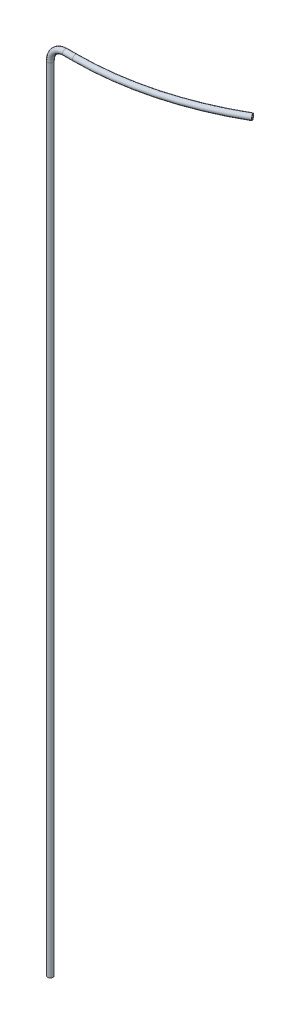
ISO-10303-21;
HEADER;
FILE_DESCRIPTION(('STEP AP214'),'2;1');
FILE_NAME('part.step','',(''),(''),'','','');
FILE_SCHEMA(('AUTOMOTIVE_DESIGN { 1 0 10303 214 1 1 1 1 }'));
ENDSEC;
DATA;
#1=APPLICATION_CONTEXT('core data for automotive mechanical design processes');
#2=APPLICATION_PROTOCOL_DEFINITION('international standard','automotive_design',2000,#1);
#3=PRODUCT_CONTEXT('',#1,'mechanical');
#4=PRODUCT('Part','Part','',(#3));
#5=PRODUCT_RELATED_PRODUCT_CATEGORY('part','',(#4));
#6=PRODUCT_DEFINITION_FORMATION('','',#4);
#7=PRODUCT_DEFINITION_CONTEXT('part definition',#1,'design');
#8=PRODUCT_DEFINITION('design','',#6,#7);
#9=PRODUCT_DEFINITION_SHAPE('','',#8);
#10=(LENGTH_UNIT() NAMED_UNIT(*) SI_UNIT(.MILLI.,.METRE.));
#11=(NAMED_UNIT(*) PLANE_ANGLE_UNIT() SI_UNIT($,.RADIAN.));
#12=(NAMED_UNIT(*) SI_UNIT($,.STERADIAN.) SOLID_ANGLE_UNIT());
#13=UNCERTAINTY_MEASURE_WITH_UNIT(LENGTH_MEASURE(1.E-05),#10,'distance_accuracy_value','');
#14=(GEOMETRIC_REPRESENTATION_CONTEXT(3) GLOBAL_UNCERTAINTY_ASSIGNED_CONTEXT((#13)) GLOBAL_UNIT_ASSIGNED_CONTEXT((#10,
#11,#12)) REPRESENTATION_CONTEXT('',''));
#15=CARTESIAN_POINT('',(0.,0.,0.));
#16=DIRECTION('',(0.,0.,1.));
#17=DIRECTION('',(1.,0.,0.));
#18=AXIS2_PLACEMENT_3D('',#15,#16,#17);
#19=CARTESIAN_POINT('',(0.,-0.371055821718923,-1900.));
#20=DIRECTION('',(0.,-1.,0.));
#21=DIRECTION('',(0.,0.,-1.));
#22=AXIS2_PLACEMENT_3D('',#19,#20,#21);
#23=TOROIDAL_SURFACE('',#22,600.,6.0000000000001);
#24=CARTESIAN_POINT('',(300.000000000001,-0.371055821718923,-1380.38475772934));
#25=DIRECTION('',(0.866025403784438,0.,-0.500000000000001));
#26=DIRECTION('',(-0.500000000000001,0.,-0.866025403784438));
#27=AXIS2_PLACEMENT_3D('',#24,#25,#26);
#28=CIRCLE('',#27,6.0000000000001);
#29=CARTESIAN_POINT('',(303.000000000001,-0.371055821718923,-1375.18860530663));
#30=VERTEX_POINT('',#29);
#31=EDGE_CURVE('E45',#30,#30,#28,.T.);
#32=CARTESIAN_POINT('',(0.,-0.371055821718923,-1300.));
#33=DIRECTION('',(-1.,0.,0.));
#34=DIRECTION('',(0.,0.,1.));
#35=AXIS2_PLACEMENT_3D('',#32,#33,#34);
#36=CIRCLE('',#35,6.0000000000001);
#37=CARTESIAN_POINT('',(0.,-0.371055821718923,-1294.));
#38=VERTEX_POINT('',#37);
#39=EDGE_CURVE('E59',#38,#38,#36,.T.);
#40=CARTESIAN_POINT('',(0.,-0.371055821718923,-1900.));
#41=DIRECTION('',(0.,-1.,0.));
#42=DIRECTION('',(0.,0.,-1.));
#43=AXIS2_PLACEMENT_3D('',#40,#41,#42);
#44=CIRCLE('',#43,606.);
#45=EDGE_CURVE('',#30,#38,#44,.T.);
#46=ORIENTED_EDGE('',*,*,#31,.F.);
#47=ORIENTED_EDGE('',*,*,#39,.F.);
#48=ORIENTED_EDGE('',*,*,#45,.T.);
#49=ORIENTED_EDGE('',*,*,#45,.F.);
#50=EDGE_LOOP('',(#46,#48,#47,#49));
#51=FACE_BOUND('',#50,.T.);
#52=ADVANCED_FACE('F38',(#51),#23,.T.);
#53=CARTESIAN_POINT('',(0.,-0.371055821718923,-1900.));
#54=DIRECTION('',(0.,-1.,0.));
#55=DIRECTION('',(0.,0.,-1.));
#56=AXIS2_PLACEMENT_3D('',#53,#54,#55);
#57=TOROIDAL_SURFACE('',#56,600.,3.99999999999999);
#58=CARTESIAN_POINT('',(300.000000000001,-0.371055821718923,-1380.38475772934));
#59=DIRECTION('',(0.866025403784438,0.,-0.500000000000001));
#60=DIRECTION('',(-0.500000000000001,0.,-0.866025403784438));
#61=AXIS2_PLACEMENT_3D('',#58,#59,#60);
#62=CIRCLE('',#61,3.99999999999999);
#63=CARTESIAN_POINT('',(302.000000000001,-0.371055821718923,-1376.9206561142));
#64=VERTEX_POINT('',#63);
#65=EDGE_CURVE('E10',#64,#64,#62,.T.);
#66=CARTESIAN_POINT('',(0.,-0.371055821718923,-1300.));
#67=DIRECTION('',(1.,0.,0.));
#68=DIRECTION('',(0.,0.,-1.));
#69=AXIS2_PLACEMENT_3D('',#66,#67,#68);
#70=CIRCLE('',#69,3.99999999999999);
#71=CARTESIAN_POINT('',(0.,-0.371055821718923,-1296.));
#72=VERTEX_POINT('',#71);
#73=EDGE_CURVE('E49',#72,#72,#70,.T.);
#74=CARTESIAN_POINT('',(0.,-0.371055821718923,-1900.));
#75=DIRECTION('',(0.,-1.,0.));
#76=DIRECTION('',(0.,0.,-1.));
#77=AXIS2_PLACEMENT_3D('',#74,#75,#76);
#78=CIRCLE('',#77,604.);
#79=EDGE_CURVE('',#64,#72,#78,.T.);
#80=ORIENTED_EDGE('',*,*,#65,.T.);
#81=ORIENTED_EDGE('',*,*,#73,.F.);
#82=ORIENTED_EDGE('',*,*,#79,.T.);
#83=ORIENTED_EDGE('',*,*,#79,.F.);
#84=EDGE_LOOP('',(#80,#82,#81,#83));
#85=FACE_BOUND('',#84,.T.);
#86=ADVANCED_FACE('F40',(#85),#57,.F.);
#87=CARTESIAN_POINT('',(950.000000000002,0.,-254.551732809568));
#88=DIRECTION('',(0.866025403784438,0.,-0.500000000000001));
#89=DIRECTION('',(-0.500000000000001,0.,-0.866025403784438));
#90=AXIS2_PLACEMENT_3D('',#87,#88,#89);
#91=PLANE('',#90);
#92=ORIENTED_EDGE('',*,*,#31,.T.);
#93=EDGE_LOOP('',(#92));
#94=FACE_BOUND('',#93,.T.);
#95=ORIENTED_EDGE('',*,*,#65,.F.);
#96=EDGE_LOOP('',(#95));
#97=FACE_BOUND('',#96,.T.);
#98=ADVANCED_FACE('F90',(#94,#97),#91,.T.);
#99=CARTESIAN_POINT('',(0.,-0.371055821718923,-1300.));
#100=DIRECTION('',(-1.,0.,0.));
#101=DIRECTION('',(0.,0.,1.));
#102=AXIS2_PLACEMENT_3D('',#99,#100,#101);
#103=CYLINDRICAL_SURFACE('',#102,6.0000000000001);
#104=CARTESIAN_POINT('',(-21.3411325230505,-0.371055821718923,-1300.));
#105=DIRECTION('',(-1.,0.,0.));
#106=DIRECTION('',(0.,0.,1.));
#107=AXIS2_PLACEMENT_3D('',#104,#105,#106);
#108=CIRCLE('',#107,6.0000000000001);
#109=CARTESIAN_POINT('',(-21.3411325230505,5.62894417828116,-1300.));
#110=VERTEX_POINT('',#109);
#111=EDGE_CURVE('E60',#110,#110,#108,.T.);
#112=ORIENTED_EDGE('',*,*,#111,.F.);
#113=EDGE_LOOP('',(#112));
#114=FACE_BOUND('',#113,.T.);
#115=ORIENTED_EDGE('',*,*,#39,.T.);
#116=EDGE_LOOP('',(#115));
#117=FACE_BOUND('',#116,.T.);
#118=ADVANCED_FACE('F83',(#114,#117),#103,.T.);
#119=CARTESIAN_POINT('',(-21.3411325230505,-32.7422911892462,-1300.));
#120=DIRECTION('',(0.,0.,1.));
#121=DIRECTION('',(1.,0.,0.));
#122=AXIS2_PLACEMENT_3D('',#119,#120,#121);
#123=TOROIDAL_SURFACE('',#122,32.3712353675273,6.0000000000001);
#124=CARTESIAN_POINT('',(-53.7123678905778,-32.7422911892462,-1300.));
#125=DIRECTION('',(0.,-1.,0.));
#126=DIRECTION('',(0.,0.,1.));
#127=AXIS2_PLACEMENT_3D('',#124,#125,#126);
#128=CIRCLE('',#127,6.0000000000001);
#129=CARTESIAN_POINT('',(-59.7123678905779,-32.7422911892462,-1300.));
#130=VERTEX_POINT('',#129);
#131=EDGE_CURVE('E56',#130,#130,#128,.T.);
#132=CARTESIAN_POINT('',(-21.3411325230505,-32.7422911892462,-1300.));
#133=DIRECTION('',(0.,0.,1.));
#134=DIRECTION('',(1.,0.,0.));
#135=AXIS2_PLACEMENT_3D('',#132,#133,#134);
#136=CIRCLE('',#135,38.3712353675274);
#137=EDGE_CURVE('',#110,#130,#136,.T.);
#138=ORIENTED_EDGE('',*,*,#111,.T.);
#139=ORIENTED_EDGE('',*,*,#131,.F.);
#140=ORIENTED_EDGE('',*,*,#137,.T.);
#141=ORIENTED_EDGE('',*,*,#137,.F.);
#142=EDGE_LOOP('',(#138,#140,#139,#141));
#143=FACE_BOUND('',#142,.T.);
#144=ADVANCED_FACE('F93',(#143),#123,.T.);
#145=CARTESIAN_POINT('',(-53.7123678905778,-32.7422911892462,-1300.));
#146=DIRECTION('',(0.,-1.,0.));
#147=DIRECTION('',(1.,0.,0.));
#148=AXIS2_PLACEMENT_3D('',#145,#146,#147);
#149=CYLINDRICAL_SURFACE('',#148,6.0000000000001);
#150=ORIENTED_EDGE('',*,*,#131,.T.);
#151=EDGE_LOOP('',(#150));
#152=FACE_BOUND('',#151,.T.);
#153=CARTESIAN_POINT('',(-53.712367890578,-1732.74229118925,-1300.));
#154=DIRECTION('',(0.,-1.,0.));
#155=DIRECTION('',(1.,0.,0.));
#156=AXIS2_PLACEMENT_3D('',#153,#154,#155);
#157=CIRCLE('',#156,6.00000000000001);
#158=CARTESIAN_POINT('',(-47.712367890578,-1732.74229118925,-1300.));
#159=VERTEX_POINT('',#158);
#160=EDGE_CURVE('E63',#159,#159,#157,.T.);
#161=ORIENTED_EDGE('',*,*,#160,.F.);
#162=EDGE_LOOP('',(#161));
#163=FACE_BOUND('',#162,.T.);
#164=ADVANCED_FACE('F105',(#152,#163),#149,.T.);
#165=CARTESIAN_POINT('',(0.,-0.371055821718923,-1300.));
#166=DIRECTION('',(-1.,0.,0.));
#167=DIRECTION('',(0.,0.,1.));
#168=AXIS2_PLACEMENT_3D('',#165,#166,#167);
#169=CYLINDRICAL_SURFACE('',#168,3.99999999999999);
#170=CARTESIAN_POINT('',(-21.3411325230505,-0.371055821718923,-1300.));
#171=DIRECTION('',(-1.,0.,0.));
#172=DIRECTION('',(0.,0.,1.));
#173=AXIS2_PLACEMENT_3D('',#170,#171,#172);
#174=CIRCLE('',#173,3.99999999999999);
#175=CARTESIAN_POINT('',(-21.3411325230505,3.62894417828106,-1300.));
#176=VERTEX_POINT('',#175);
#177=EDGE_CURVE('E66',#176,#176,#174,.F.);
#178=ORIENTED_EDGE('',*,*,#177,.F.);
#179=EDGE_LOOP('',(#178));
#180=FACE_BOUND('',#179,.T.);
#181=ORIENTED_EDGE('',*,*,#73,.T.);
#182=EDGE_LOOP('',(#181));
#183=FACE_BOUND('',#182,.T.);
#184=ADVANCED_FACE('F108',(#180,#183),#169,.F.);
#185=CARTESIAN_POINT('',(-21.3411325230505,-32.7422911892462,-1300.));
#186=DIRECTION('',(0.,0.,1.));
#187=DIRECTION('',(1.,0.,0.));
#188=AXIS2_PLACEMENT_3D('',#185,#186,#187);
#189=TOROIDAL_SURFACE('',#188,32.3712353675273,3.99999999999999);
#190=CARTESIAN_POINT('',(-53.7123678905778,-32.7422911892462,-1300.));
#191=DIRECTION('',(0.,-1.,0.));
#192=DIRECTION('',(0.,0.,1.));
#193=AXIS2_PLACEMENT_3D('',#190,#191,#192);
#194=CIRCLE('',#193,3.99999999999999);
#195=CARTESIAN_POINT('',(-57.7123678905778,-32.7422911892462,-1300.));
#196=VERTEX_POINT('',#195);
#197=EDGE_CURVE('E53',#196,#196,#194,.F.);
#198=CARTESIAN_POINT('',(-21.3411325230505,-32.7422911892462,-1300.));
#199=DIRECTION('',(0.,0.,1.));
#200=DIRECTION('',(1.,0.,0.));
#201=AXIS2_PLACEMENT_3D('',#198,#199,#200);
#202=CIRCLE('',#201,36.3712353675273);
#203=EDGE_CURVE('',#176,#196,#202,.T.);
#204=ORIENTED_EDGE('',*,*,#177,.T.);
#205=ORIENTED_EDGE('',*,*,#197,.F.);
#206=ORIENTED_EDGE('',*,*,#203,.T.);
#207=ORIENTED_EDGE('',*,*,#203,.F.);
#208=EDGE_LOOP('',(#204,#206,#205,#207));
#209=FACE_BOUND('',#208,.T.);
#210=ADVANCED_FACE('F87',(#209),#189,.F.);
#211=CARTESIAN_POINT('',(-53.7123678905778,-32.7422911892462,-1300.));
#212=DIRECTION('',(0.,-1.,0.));
#213=DIRECTION('',(1.,0.,0.));
#214=AXIS2_PLACEMENT_3D('',#211,#212,#213);
#215=CYLINDRICAL_SURFACE('',#214,3.99999999999999);
#216=ORIENTED_EDGE('',*,*,#197,.T.);
#217=EDGE_LOOP('',(#216));
#218=FACE_BOUND('',#217,.T.);
#219=CARTESIAN_POINT('',(-53.712367890578,-1732.74229118925,-1300.));
#220=DIRECTION('',(0.,-1.,0.));
#221=DIRECTION('',(1.,0.,0.));
#222=AXIS2_PLACEMENT_3D('',#219,#220,#221);
#223=CIRCLE('',#222,4.00000000000001);
#224=CARTESIAN_POINT('',(-49.712367890578,-1732.74229118925,-1300.));
#225=VERTEX_POINT('',#224);
#226=EDGE_CURVE('E73',#225,#225,#223,.T.);
#227=ORIENTED_EDGE('',*,*,#226,.T.);
#228=EDGE_LOOP('',(#227));
#229=FACE_BOUND('',#228,.T.);
#230=ADVANCED_FACE('F77',(#218,#229),#215,.F.);
#231=CARTESIAN_POINT('',(-53.712367890578,-1732.74229118925,-1300.));
#232=DIRECTION('',(0.,-1.,0.));
#233=DIRECTION('',(1.,0.,0.));
#234=AXIS2_PLACEMENT_3D('',#231,#232,#233);
#235=PLANE('',#234);
#236=ORIENTED_EDGE('',*,*,#160,.T.);
#237=EDGE_LOOP('',(#236));
#238=FACE_BOUND('',#237,.T.);
#239=ORIENTED_EDGE('',*,*,#226,.F.);
#240=EDGE_LOOP('',(#239));
#241=FACE_BOUND('',#240,.T.);
#242=ADVANCED_FACE('F79',(#238,#241),#235,.T.);
#243=CLOSED_SHELL('',(#52,#86,#98,#118,#144,#164,#184,#210,#230,#242));
#244=MANIFOLD_SOLID_BREP('B2',#243);
#245=ADVANCED_BREP_SHAPE_REPRESENTATION('',(#18,#244),#14);
#246=SHAPE_DEFINITION_REPRESENTATION(#9,#245);
ENDSEC;
END-ISO-10303-21;
